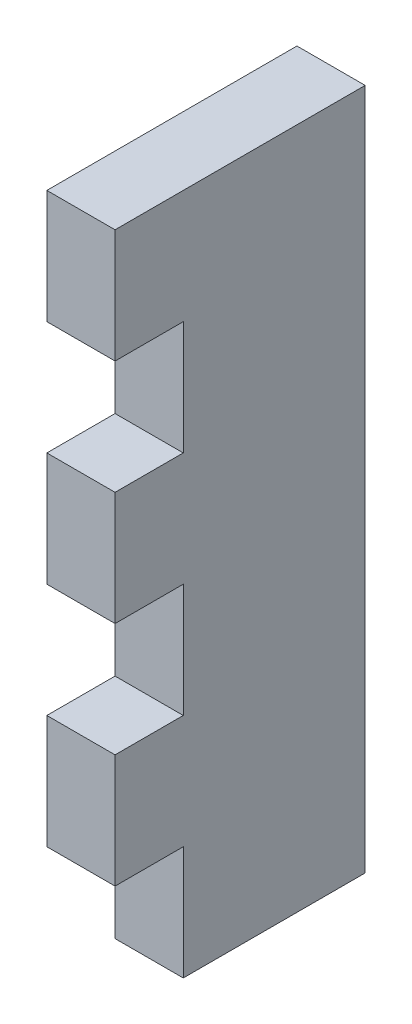
ISO-10303-21;
HEADER;
FILE_DESCRIPTION(('STEP AP214'),'2;1');
FILE_NAME('part.step','',(''),(''),'','','');
FILE_SCHEMA(('AUTOMOTIVE_DESIGN { 1 0 10303 214 1 1 1 1 }'));
ENDSEC;
DATA;
#1=APPLICATION_CONTEXT('core data for automotive mechanical design processes');
#2=APPLICATION_PROTOCOL_DEFINITION('international standard','automotive_design',2000,#1);
#3=PRODUCT_CONTEXT('',#1,'mechanical');
#4=PRODUCT('Part','Part','',(#3));
#5=PRODUCT_RELATED_PRODUCT_CATEGORY('part','',(#4));
#6=PRODUCT_DEFINITION_FORMATION('','',#4);
#7=PRODUCT_DEFINITION_CONTEXT('part definition',#1,'design');
#8=PRODUCT_DEFINITION('design','',#6,#7);
#9=PRODUCT_DEFINITION_SHAPE('','',#8);
#10=(LENGTH_UNIT() NAMED_UNIT(*) SI_UNIT(.MILLI.,.METRE.));
#11=(NAMED_UNIT(*) PLANE_ANGLE_UNIT() SI_UNIT($,.RADIAN.));
#12=(NAMED_UNIT(*) SI_UNIT($,.STERADIAN.) SOLID_ANGLE_UNIT());
#13=UNCERTAINTY_MEASURE_WITH_UNIT(LENGTH_MEASURE(1.E-05),#10,'distance_accuracy_value','');
#14=(GEOMETRIC_REPRESENTATION_CONTEXT(3) GLOBAL_UNCERTAINTY_ASSIGNED_CONTEXT((#13)) GLOBAL_UNIT_ASSIGNED_CONTEXT((#10,
#11,#12)) REPRESENTATION_CONTEXT('',''));
#15=CARTESIAN_POINT('',(0.,0.,0.));
#16=DIRECTION('',(0.,0.,1.));
#17=DIRECTION('',(1.,0.,0.));
#18=AXIS2_PLACEMENT_3D('',#15,#16,#17);
#19=CARTESIAN_POINT('',(3.,15.,5.5));
#20=DIRECTION('',(0.,0.,-1.));
#21=DIRECTION('',(0.,1.,0.));
#22=AXIS2_PLACEMENT_3D('',#19,#20,#21);
#23=PLANE('',#22);
#24=DIRECTION('',(0.,-1.,0.));
#25=VECTOR('',#24,1.);
#26=CARTESIAN_POINT('',(0.,15.,5.5));
#27=LINE('',#26,#25);
#28=CARTESIAN_POINT('',(0.,15.,5.5));
#29=VERTEX_POINT('',#28);
#30=CARTESIAN_POINT('',(0.,10.,5.5));
#31=VERTEX_POINT('',#30);
#32=EDGE_CURVE('E159',#29,#31,#27,.T.);
#33=ORIENTED_EDGE('',*,*,#32,.T.);
#34=DIRECTION('',(1.,0.,0.));
#35=VECTOR('',#34,1.);
#36=CARTESIAN_POINT('',(0.,10.,5.5));
#37=LINE('',#36,#35);
#38=CARTESIAN_POINT('',(3.,10.,5.5));
#39=VERTEX_POINT('',#38);
#40=EDGE_CURVE('E197',#31,#39,#37,.T.);
#41=ORIENTED_EDGE('',*,*,#40,.T.);
#42=DIRECTION('',(0.,-1.,0.));
#43=VECTOR('',#42,1.);
#44=CARTESIAN_POINT('',(3.,15.,5.5));
#45=LINE('',#44,#43);
#46=CARTESIAN_POINT('',(3.,15.,5.5));
#47=VERTEX_POINT('',#46);
#48=EDGE_CURVE('E181',#47,#39,#45,.T.);
#49=ORIENTED_EDGE('',*,*,#48,.F.);
#50=DIRECTION('',(-1.,0.,0.));
#51=VECTOR('',#50,1.);
#52=CARTESIAN_POINT('',(3.,15.,5.5));
#53=LINE('',#52,#51);
#54=EDGE_CURVE('E41',#47,#29,#53,.T.);
#55=ORIENTED_EDGE('',*,*,#54,.T.);
#56=EDGE_LOOP('',(#33,#41,#49,#55));
#57=FACE_BOUND('',#56,.T.);
#58=ADVANCED_FACE('F33',(#57),#23,.F.);
#59=CARTESIAN_POINT('',(3.,5.,5.5));
#60=VERTEX_POINT('',#59);
#61=CARTESIAN_POINT('',(3.,0.,5.5));
#62=VERTEX_POINT('',#61);
#63=EDGE_CURVE('E151',#60,#62,#45,.T.);
#64=ORIENTED_EDGE('',*,*,#63,.F.);
#65=DIRECTION('',(1.,0.,0.));
#66=VECTOR('',#65,1.);
#67=CARTESIAN_POINT('',(0.,5.,5.5));
#68=LINE('',#67,#66);
#69=CARTESIAN_POINT('',(0.,5.,5.5));
#70=VERTEX_POINT('',#69);
#71=EDGE_CURVE('E137',#70,#60,#68,.T.);
#72=ORIENTED_EDGE('',*,*,#71,.F.);
#73=CARTESIAN_POINT('',(0.,0.,5.5));
#74=VERTEX_POINT('',#73);
#75=EDGE_CURVE('E149',#70,#74,#27,.T.);
#76=ORIENTED_EDGE('',*,*,#75,.T.);
#77=DIRECTION('',(1.,0.,0.));
#78=VECTOR('',#77,1.);
#79=CARTESIAN_POINT('',(0.,0.,5.5));
#80=LINE('',#79,#78);
#81=EDGE_CURVE('E212',#74,#62,#80,.T.);
#82=ORIENTED_EDGE('',*,*,#81,.T.);
#83=EDGE_LOOP('',(#64,#72,#76,#82));
#84=FACE_BOUND('',#83,.T.);
#85=ADVANCED_FACE('F147',(#84),#23,.F.);
#86=CARTESIAN_POINT('',(3.,15.,-5.5));
#87=DIRECTION('',(0.,0.,1.));
#88=DIRECTION('',(0.,-1.,0.));
#89=AXIS2_PLACEMENT_3D('',#86,#87,#88);
#90=PLANE('',#89);
#91=DIRECTION('',(0.,1.,0.));
#92=VECTOR('',#91,1.);
#93=CARTESIAN_POINT('',(0.,15.,-5.5));
#94=LINE('',#93,#92);
#95=CARTESIAN_POINT('',(0.,-15.,-5.5));
#96=VERTEX_POINT('',#95);
#97=CARTESIAN_POINT('',(0.,15.,-5.5));
#98=VERTEX_POINT('',#97);
#99=EDGE_CURVE('E199',#96,#98,#94,.T.);
#100=ORIENTED_EDGE('',*,*,#99,.T.);
#101=DIRECTION('',(-1.,0.,0.));
#102=VECTOR('',#101,1.);
#103=CARTESIAN_POINT('',(3.,15.,-5.5));
#104=LINE('',#103,#102);
#105=CARTESIAN_POINT('',(3.,15.,-5.5));
#106=VERTEX_POINT('',#105);
#107=EDGE_CURVE('E11',#106,#98,#104,.T.);
#108=ORIENTED_EDGE('',*,*,#107,.F.);
#109=DIRECTION('',(0.,1.,0.));
#110=VECTOR('',#109,1.);
#111=CARTESIAN_POINT('',(3.,15.,-5.5));
#112=LINE('',#111,#110);
#113=CARTESIAN_POINT('',(3.,-15.,-5.5));
#114=VERTEX_POINT('',#113);
#115=EDGE_CURVE('E170',#114,#106,#112,.T.);
#116=ORIENTED_EDGE('',*,*,#115,.F.);
#117=DIRECTION('',(-1.,0.,0.));
#118=VECTOR('',#117,1.);
#119=CARTESIAN_POINT('',(3.,-15.,-5.5));
#120=LINE('',#119,#118);
#121=EDGE_CURVE('E171',#114,#96,#120,.T.);
#122=ORIENTED_EDGE('',*,*,#121,.T.);
#123=EDGE_LOOP('',(#100,#108,#116,#122));
#124=FACE_BOUND('',#123,.T.);
#125=ADVANCED_FACE('F35',(#124),#90,.F.);
#126=CARTESIAN_POINT('',(3.,15.,5.5));
#127=DIRECTION('',(0.,-1.,0.));
#128=DIRECTION('',(0.,0.,-1.));
#129=AXIS2_PLACEMENT_3D('',#126,#127,#128);
#130=PLANE('',#129);
#131=DIRECTION('',(0.,0.,1.));
#132=VECTOR('',#131,1.);
#133=CARTESIAN_POINT('',(0.,15.,5.5));
#134=LINE('',#133,#132);
#135=EDGE_CURVE('E165',#98,#29,#134,.T.);
#136=ORIENTED_EDGE('',*,*,#135,.T.);
#137=ORIENTED_EDGE('',*,*,#54,.F.);
#138=DIRECTION('',(0.,0.,1.));
#139=VECTOR('',#138,1.);
#140=CARTESIAN_POINT('',(3.,15.,5.5));
#141=LINE('',#140,#139);
#142=EDGE_CURVE('E242',#106,#47,#141,.T.);
#143=ORIENTED_EDGE('',*,*,#142,.F.);
#144=ORIENTED_EDGE('',*,*,#107,.T.);
#145=EDGE_LOOP('',(#136,#137,#143,#144));
#146=FACE_BOUND('',#145,.T.);
#147=ADVANCED_FACE('F249',(#146),#130,.F.);
#148=CARTESIAN_POINT('',(0.,-5.,5.5));
#149=VERTEX_POINT('',#148);
#150=CARTESIAN_POINT('',(0.,-10.,5.5));
#151=VERTEX_POINT('',#150);
#152=EDGE_CURVE('E160',#149,#151,#27,.T.);
#153=ORIENTED_EDGE('',*,*,#152,.T.);
#154=DIRECTION('',(1.,0.,0.));
#155=VECTOR('',#154,1.);
#156=CARTESIAN_POINT('',(0.,-10.,5.5));
#157=LINE('',#156,#155);
#158=CARTESIAN_POINT('',(3.,-10.,5.5));
#159=VERTEX_POINT('',#158);
#160=EDGE_CURVE('E193',#151,#159,#157,.T.);
#161=ORIENTED_EDGE('',*,*,#160,.T.);
#162=CARTESIAN_POINT('',(3.,-5.,5.5));
#163=VERTEX_POINT('',#162);
#164=EDGE_CURVE('E244',#163,#159,#45,.T.);
#165=ORIENTED_EDGE('',*,*,#164,.F.);
#166=DIRECTION('',(1.,0.,0.));
#167=VECTOR('',#166,1.);
#168=CARTESIAN_POINT('',(0.,-5.,5.5));
#169=LINE('',#168,#167);
#170=EDGE_CURVE('E226',#149,#163,#169,.T.);
#171=ORIENTED_EDGE('',*,*,#170,.F.);
#172=EDGE_LOOP('',(#153,#161,#165,#171));
#173=FACE_BOUND('',#172,.T.);
#174=ADVANCED_FACE('F269',(#173),#23,.F.);
#175=CARTESIAN_POINT('',(3.,-15.,5.5));
#176=DIRECTION('',(0.,1.,0.));
#177=DIRECTION('',(0.,0.,1.));
#178=AXIS2_PLACEMENT_3D('',#175,#176,#177);
#179=PLANE('',#178);
#180=DIRECTION('',(0.,0.,-1.));
#181=VECTOR('',#180,1.);
#182=CARTESIAN_POINT('',(3.,-15.,5.5));
#183=LINE('',#182,#181);
#184=CARTESIAN_POINT('',(3.,-15.,2.5));
#185=VERTEX_POINT('',#184);
#186=EDGE_CURVE('E173',#185,#114,#183,.T.);
#187=ORIENTED_EDGE('',*,*,#186,.F.);
#188=DIRECTION('',(1.,0.,0.));
#189=VECTOR('',#188,1.);
#190=CARTESIAN_POINT('',(0.,-15.,2.5));
#191=LINE('',#190,#189);
#192=CARTESIAN_POINT('',(0.,-15.,2.5));
#193=VERTEX_POINT('',#192);
#194=EDGE_CURVE('E208',#193,#185,#191,.T.);
#195=ORIENTED_EDGE('',*,*,#194,.F.);
#196=DIRECTION('',(0.,0.,-1.));
#197=VECTOR('',#196,1.);
#198=CARTESIAN_POINT('',(0.,-15.,5.5));
#199=LINE('',#198,#197);
#200=EDGE_CURVE('E163',#193,#96,#199,.T.);
#201=ORIENTED_EDGE('',*,*,#200,.T.);
#202=ORIENTED_EDGE('',*,*,#121,.F.);
#203=EDGE_LOOP('',(#187,#195,#201,#202));
#204=FACE_BOUND('',#203,.T.);
#205=ADVANCED_FACE('F260',(#204),#179,.F.);
#206=CARTESIAN_POINT('',(3.,0.,0.));
#207=DIRECTION('',(1.,0.,0.));
#208=DIRECTION('',(0.,0.,-1.));
#209=AXIS2_PLACEMENT_3D('',#206,#207,#208);
#210=PLANE('',#209);
#211=DIRECTION('',(0.,0.,1.));
#212=VECTOR('',#211,1.);
#213=CARTESIAN_POINT('',(3.,10.,5.5));
#214=LINE('',#213,#212);
#215=CARTESIAN_POINT('',(3.,10.,2.5));
#216=VERTEX_POINT('',#215);
#217=EDGE_CURVE('E142',#216,#39,#214,.T.);
#218=ORIENTED_EDGE('',*,*,#217,.F.);
#219=DIRECTION('',(0.,1.,0.));
#220=VECTOR('',#219,1.);
#221=CARTESIAN_POINT('',(3.,10.,2.5));
#222=LINE('',#221,#220);
#223=CARTESIAN_POINT('',(3.,5.,2.5));
#224=VERTEX_POINT('',#223);
#225=EDGE_CURVE('E192',#224,#216,#222,.T.);
#226=ORIENTED_EDGE('',*,*,#225,.F.);
#227=DIRECTION('',(0.,0.,-1.));
#228=VECTOR('',#227,1.);
#229=CARTESIAN_POINT('',(3.,5.,5.5));
#230=LINE('',#229,#228);
#231=EDGE_CURVE('E190',#60,#224,#230,.T.);
#232=ORIENTED_EDGE('',*,*,#231,.F.);
#233=ORIENTED_EDGE('',*,*,#63,.T.);
#234=DIRECTION('',(0.,0.,1.));
#235=VECTOR('',#234,1.);
#236=CARTESIAN_POINT('',(3.,0.,5.5));
#237=LINE('',#236,#235);
#238=CARTESIAN_POINT('',(3.,0.,2.5));
#239=VERTEX_POINT('',#238);
#240=EDGE_CURVE('E223',#239,#62,#237,.T.);
#241=ORIENTED_EDGE('',*,*,#240,.F.);
#242=DIRECTION('',(0.,1.,0.));
#243=VECTOR('',#242,1.);
#244=CARTESIAN_POINT('',(3.,0.,2.5));
#245=LINE('',#244,#243);
#246=CARTESIAN_POINT('',(3.,-5.,2.5));
#247=VERTEX_POINT('',#246);
#248=EDGE_CURVE('E230',#247,#239,#245,.T.);
#249=ORIENTED_EDGE('',*,*,#248,.F.);
#250=DIRECTION('',(0.,0.,-1.));
#251=VECTOR('',#250,1.);
#252=CARTESIAN_POINT('',(3.,-5.,5.5));
#253=LINE('',#252,#251);
#254=EDGE_CURVE('E227',#163,#247,#253,.T.);
#255=ORIENTED_EDGE('',*,*,#254,.F.);
#256=ORIENTED_EDGE('',*,*,#164,.T.);
#257=DIRECTION('',(0.,0.,1.));
#258=VECTOR('',#257,1.);
#259=CARTESIAN_POINT('',(3.,-10.,5.5));
#260=LINE('',#259,#258);
#261=CARTESIAN_POINT('',(3.,-10.,2.5));
#262=VERTEX_POINT('',#261);
#263=EDGE_CURVE('E206',#262,#159,#260,.T.);
#264=ORIENTED_EDGE('',*,*,#263,.F.);
#265=DIRECTION('',(0.,1.,0.));
#266=VECTOR('',#265,1.);
#267=CARTESIAN_POINT('',(3.,-10.,2.5));
#268=LINE('',#267,#266);
#269=EDGE_CURVE('E209',#185,#262,#268,.T.);
#270=ORIENTED_EDGE('',*,*,#269,.F.);
#271=ORIENTED_EDGE('',*,*,#186,.T.);
#272=ORIENTED_EDGE('',*,*,#115,.T.);
#273=ORIENTED_EDGE('',*,*,#142,.T.);
#274=ORIENTED_EDGE('',*,*,#48,.T.);
#275=EDGE_LOOP('',(#218,#226,#232,#233,#241,#249,#255,#256,#264,#270,#271,#272,#273,#274));
#276=FACE_BOUND('',#275,.T.);
#277=ADVANCED_FACE('F254',(#276),#210,.T.);
#278=CARTESIAN_POINT('',(0.,0.,0.));
#279=DIRECTION('',(1.,0.,0.));
#280=DIRECTION('',(0.,0.,-1.));
#281=AXIS2_PLACEMENT_3D('',#278,#279,#280);
#282=PLANE('',#281);
#283=DIRECTION('',(0.,1.,0.));
#284=VECTOR('',#283,1.);
#285=CARTESIAN_POINT('',(0.,10.,2.5));
#286=LINE('',#285,#284);
#287=CARTESIAN_POINT('',(0.,5.,2.5));
#288=VERTEX_POINT('',#287);
#289=CARTESIAN_POINT('',(0.,10.,2.5));
#290=VERTEX_POINT('',#289);
#291=EDGE_CURVE('E48',#288,#290,#286,.T.);
#292=ORIENTED_EDGE('',*,*,#291,.T.);
#293=DIRECTION('',(0.,0.,1.));
#294=VECTOR('',#293,1.);
#295=CARTESIAN_POINT('',(0.,10.,5.5));
#296=LINE('',#295,#294);
#297=EDGE_CURVE('E152',#290,#31,#296,.T.);
#298=ORIENTED_EDGE('',*,*,#297,.T.);
#299=ORIENTED_EDGE('',*,*,#32,.F.);
#300=ORIENTED_EDGE('',*,*,#135,.F.);
#301=ORIENTED_EDGE('',*,*,#99,.F.);
#302=ORIENTED_EDGE('',*,*,#200,.F.);
#303=DIRECTION('',(0.,1.,0.));
#304=VECTOR('',#303,1.);
#305=CARTESIAN_POINT('',(0.,-10.,2.5));
#306=LINE('',#305,#304);
#307=CARTESIAN_POINT('',(0.,-10.,2.5));
#308=VERTEX_POINT('',#307);
#309=EDGE_CURVE('E203',#193,#308,#306,.T.);
#310=ORIENTED_EDGE('',*,*,#309,.T.);
#311=DIRECTION('',(0.,0.,1.));
#312=VECTOR('',#311,1.);
#313=CARTESIAN_POINT('',(0.,-10.,5.5));
#314=LINE('',#313,#312);
#315=EDGE_CURVE('E56',#308,#151,#314,.T.);
#316=ORIENTED_EDGE('',*,*,#315,.T.);
#317=ORIENTED_EDGE('',*,*,#152,.F.);
#318=DIRECTION('',(0.,0.,-1.));
#319=VECTOR('',#318,1.);
#320=CARTESIAN_POINT('',(0.,-5.,5.5));
#321=LINE('',#320,#319);
#322=CARTESIAN_POINT('',(0.,-5.,2.5));
#323=VERTEX_POINT('',#322);
#324=EDGE_CURVE('E219',#149,#323,#321,.T.);
#325=ORIENTED_EDGE('',*,*,#324,.T.);
#326=DIRECTION('',(0.,1.,0.));
#327=VECTOR('',#326,1.);
#328=CARTESIAN_POINT('',(0.,0.,2.5));
#329=LINE('',#328,#327);
#330=CARTESIAN_POINT('',(0.,0.,2.5));
#331=VERTEX_POINT('',#330);
#332=EDGE_CURVE('E222',#323,#331,#329,.T.);
#333=ORIENTED_EDGE('',*,*,#332,.T.);
#334=DIRECTION('',(0.,0.,1.));
#335=VECTOR('',#334,1.);
#336=CARTESIAN_POINT('',(0.,0.,5.5));
#337=LINE('',#336,#335);
#338=EDGE_CURVE('E158',#331,#74,#337,.T.);
#339=ORIENTED_EDGE('',*,*,#338,.T.);
#340=ORIENTED_EDGE('',*,*,#75,.F.);
#341=DIRECTION('',(0.,0.,-1.));
#342=VECTOR('',#341,1.);
#343=CARTESIAN_POINT('',(0.,5.,5.5));
#344=LINE('',#343,#342);
#345=EDGE_CURVE('E133',#70,#288,#344,.T.);
#346=ORIENTED_EDGE('',*,*,#345,.T.);
#347=EDGE_LOOP('',(#292,#298,#299,#300,#301,#302,#310,#316,#317,#325,#333,#339,#340,#346));
#348=FACE_BOUND('',#347,.T.);
#349=ADVANCED_FACE('F155',(#348),#282,.F.);
#350=CARTESIAN_POINT('',(0.,0.,5.5));
#351=DIRECTION('',(0.,1.,0.));
#352=DIRECTION('',(0.,0.,1.));
#353=AXIS2_PLACEMENT_3D('',#350,#351,#352);
#354=PLANE('',#353);
#355=ORIENTED_EDGE('',*,*,#240,.T.);
#356=ORIENTED_EDGE('',*,*,#81,.F.);
#357=ORIENTED_EDGE('',*,*,#338,.F.);
#358=DIRECTION('',(1.,0.,0.));
#359=VECTOR('',#358,1.);
#360=CARTESIAN_POINT('',(0.,0.,2.5));
#361=LINE('',#360,#359);
#362=EDGE_CURVE('E235',#331,#239,#361,.T.);
#363=ORIENTED_EDGE('',*,*,#362,.T.);
#364=EDGE_LOOP('',(#355,#356,#357,#363));
#365=FACE_BOUND('',#364,.T.);
#366=ADVANCED_FACE('F335',(#365),#354,.F.);
#367=CARTESIAN_POINT('',(0.,0.,2.5));
#368=DIRECTION('',(0.,0.,-1.));
#369=DIRECTION('',(0.,1.,0.));
#370=AXIS2_PLACEMENT_3D('',#367,#368,#369);
#371=PLANE('',#370);
#372=ORIENTED_EDGE('',*,*,#248,.T.);
#373=ORIENTED_EDGE('',*,*,#362,.F.);
#374=ORIENTED_EDGE('',*,*,#332,.F.);
#375=DIRECTION('',(1.,0.,0.));
#376=VECTOR('',#375,1.);
#377=CARTESIAN_POINT('',(0.,-5.,2.5));
#378=LINE('',#377,#376);
#379=EDGE_CURVE('E237',#323,#247,#378,.T.);
#380=ORIENTED_EDGE('',*,*,#379,.T.);
#381=EDGE_LOOP('',(#372,#373,#374,#380));
#382=FACE_BOUND('',#381,.T.);
#383=ADVANCED_FACE('F344',(#382),#371,.F.);
#384=CARTESIAN_POINT('',(0.,-5.,5.5));
#385=DIRECTION('',(0.,-1.,0.));
#386=DIRECTION('',(0.,0.,-1.));
#387=AXIS2_PLACEMENT_3D('',#384,#385,#386);
#388=PLANE('',#387);
#389=ORIENTED_EDGE('',*,*,#254,.T.);
#390=ORIENTED_EDGE('',*,*,#379,.F.);
#391=ORIENTED_EDGE('',*,*,#324,.F.);
#392=ORIENTED_EDGE('',*,*,#170,.T.);
#393=EDGE_LOOP('',(#389,#390,#391,#392));
#394=FACE_BOUND('',#393,.T.);
#395=ADVANCED_FACE('F354',(#394),#388,.F.);
#396=CARTESIAN_POINT('',(0.,-10.,5.5));
#397=DIRECTION('',(0.,1.,0.));
#398=DIRECTION('',(0.,0.,1.));
#399=AXIS2_PLACEMENT_3D('',#396,#397,#398);
#400=PLANE('',#399);
#401=ORIENTED_EDGE('',*,*,#263,.T.);
#402=ORIENTED_EDGE('',*,*,#160,.F.);
#403=ORIENTED_EDGE('',*,*,#315,.F.);
#404=DIRECTION('',(1.,0.,0.));
#405=VECTOR('',#404,1.);
#406=CARTESIAN_POINT('',(0.,-10.,2.5));
#407=LINE('',#406,#405);
#408=EDGE_CURVE('E216',#308,#262,#407,.T.);
#409=ORIENTED_EDGE('',*,*,#408,.T.);
#410=EDGE_LOOP('',(#401,#402,#403,#409));
#411=FACE_BOUND('',#410,.T.);
#412=ADVANCED_FACE('F265',(#411),#400,.F.);
#413=CARTESIAN_POINT('',(0.,-10.,2.5));
#414=DIRECTION('',(0.,0.,-1.));
#415=DIRECTION('',(0.,1.,0.));
#416=AXIS2_PLACEMENT_3D('',#413,#414,#415);
#417=PLANE('',#416);
#418=ORIENTED_EDGE('',*,*,#269,.T.);
#419=ORIENTED_EDGE('',*,*,#408,.F.);
#420=ORIENTED_EDGE('',*,*,#309,.F.);
#421=ORIENTED_EDGE('',*,*,#194,.T.);
#422=EDGE_LOOP('',(#418,#419,#420,#421));
#423=FACE_BOUND('',#422,.T.);
#424=ADVANCED_FACE('F264',(#423),#417,.F.);
#425=CARTESIAN_POINT('',(0.,10.,5.5));
#426=DIRECTION('',(0.,1.,0.));
#427=DIRECTION('',(0.,0.,1.));
#428=AXIS2_PLACEMENT_3D('',#425,#426,#427);
#429=PLANE('',#428);
#430=ORIENTED_EDGE('',*,*,#217,.T.);
#431=ORIENTED_EDGE('',*,*,#40,.F.);
#432=ORIENTED_EDGE('',*,*,#297,.F.);
#433=DIRECTION('',(1.,0.,0.));
#434=VECTOR('',#433,1.);
#435=CARTESIAN_POINT('',(0.,10.,2.5));
#436=LINE('',#435,#434);
#437=EDGE_CURVE('E200',#290,#216,#436,.T.);
#438=ORIENTED_EDGE('',*,*,#437,.T.);
#439=EDGE_LOOP('',(#430,#431,#432,#438));
#440=FACE_BOUND('',#439,.T.);
#441=ADVANCED_FACE('F276',(#440),#429,.F.);
#442=CARTESIAN_POINT('',(0.,10.,2.5));
#443=DIRECTION('',(0.,0.,-1.));
#444=DIRECTION('',(0.,1.,0.));
#445=AXIS2_PLACEMENT_3D('',#442,#443,#444);
#446=PLANE('',#445);
#447=ORIENTED_EDGE('',*,*,#225,.T.);
#448=ORIENTED_EDGE('',*,*,#437,.F.);
#449=ORIENTED_EDGE('',*,*,#291,.F.);
#450=DIRECTION('',(1.,0.,0.));
#451=VECTOR('',#450,1.);
#452=CARTESIAN_POINT('',(0.,5.,2.5));
#453=LINE('',#452,#451);
#454=EDGE_CURVE('E139',#288,#224,#453,.T.);
#455=ORIENTED_EDGE('',*,*,#454,.T.);
#456=EDGE_LOOP('',(#447,#448,#449,#455));
#457=FACE_BOUND('',#456,.T.);
#458=ADVANCED_FACE('F275',(#457),#446,.F.);
#459=CARTESIAN_POINT('',(0.,5.,5.5));
#460=DIRECTION('',(0.,-1.,0.));
#461=DIRECTION('',(0.,0.,-1.));
#462=AXIS2_PLACEMENT_3D('',#459,#460,#461);
#463=PLANE('',#462);
#464=ORIENTED_EDGE('',*,*,#231,.T.);
#465=ORIENTED_EDGE('',*,*,#454,.F.);
#466=ORIENTED_EDGE('',*,*,#345,.F.);
#467=ORIENTED_EDGE('',*,*,#71,.T.);
#468=EDGE_LOOP('',(#464,#465,#466,#467));
#469=FACE_BOUND('',#468,.T.);
#470=ADVANCED_FACE('F136',(#469),#463,.F.);
#471=CLOSED_SHELL('',(#58,#85,#125,#147,#174,#205,#277,#349,#366,#383,#395,#412,#424,#441,#458,#470));
#472=MANIFOLD_SOLID_BREP('B2',#471);
#473=ADVANCED_BREP_SHAPE_REPRESENTATION('',(#18,#472),#14);
#474=SHAPE_DEFINITION_REPRESENTATION(#9,#473);
ENDSEC;
END-ISO-10303-21;
